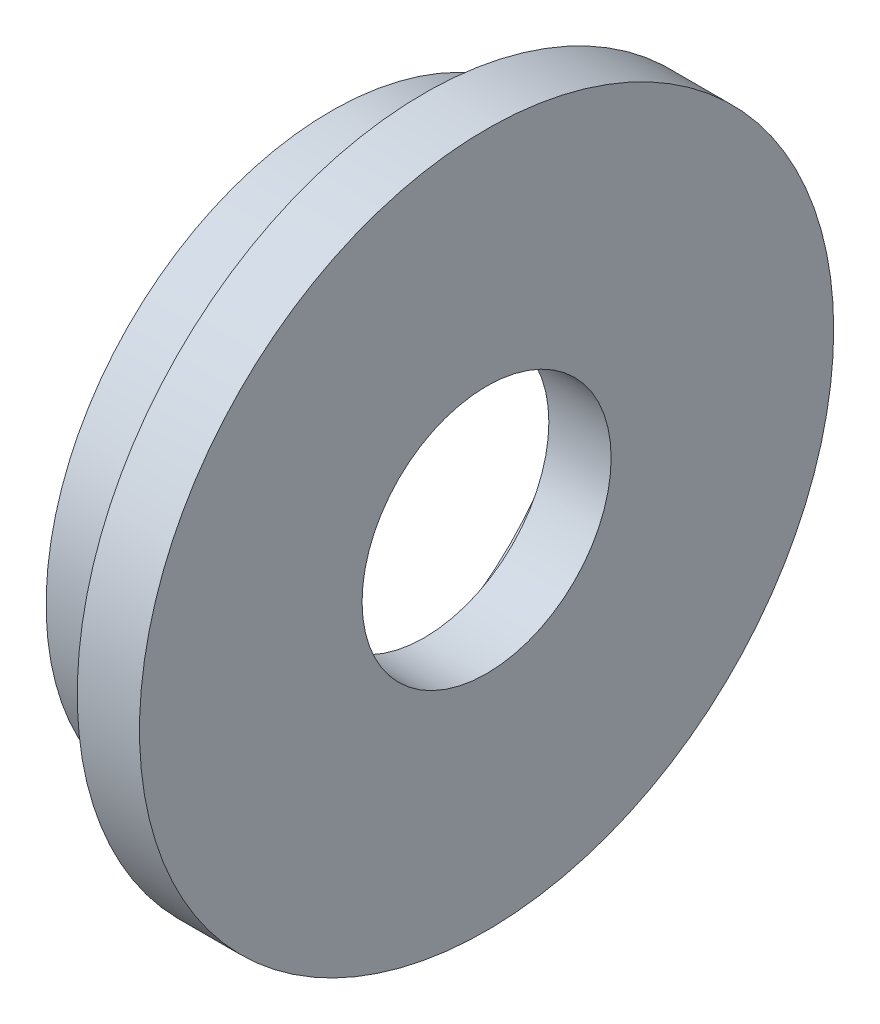
ISO-10303-21;
HEADER;
FILE_DESCRIPTION(('STEP AP214'),'2;1');
FILE_NAME('part.step','',(''),(''),'','','');
FILE_SCHEMA(('AUTOMOTIVE_DESIGN { 1 0 10303 214 1 1 1 1 }'));
ENDSEC;
DATA;
#1=APPLICATION_CONTEXT('core data for automotive mechanical design processes');
#2=APPLICATION_PROTOCOL_DEFINITION('international standard','automotive_design',2000,#1);
#3=PRODUCT_CONTEXT('',#1,'mechanical');
#4=PRODUCT('Part','Part','',(#3));
#5=PRODUCT_RELATED_PRODUCT_CATEGORY('part','',(#4));
#6=PRODUCT_DEFINITION_FORMATION('','',#4);
#7=PRODUCT_DEFINITION_CONTEXT('part definition',#1,'design');
#8=PRODUCT_DEFINITION('design','',#6,#7);
#9=PRODUCT_DEFINITION_SHAPE('','',#8);
#10=(LENGTH_UNIT() NAMED_UNIT(*) SI_UNIT(.MILLI.,.METRE.));
#11=(NAMED_UNIT(*) PLANE_ANGLE_UNIT() SI_UNIT($,.RADIAN.));
#12=(NAMED_UNIT(*) SI_UNIT($,.STERADIAN.) SOLID_ANGLE_UNIT());
#13=UNCERTAINTY_MEASURE_WITH_UNIT(LENGTH_MEASURE(1.E-05),#10,'distance_accuracy_value','');
#14=(GEOMETRIC_REPRESENTATION_CONTEXT(3) GLOBAL_UNCERTAINTY_ASSIGNED_CONTEXT((#13)) GLOBAL_UNIT_ASSIGNED_CONTEXT((#10,
#11,#12)) REPRESENTATION_CONTEXT('',''));
#15=CARTESIAN_POINT('',(0.,0.,0.));
#16=DIRECTION('',(0.,0.,1.));
#17=DIRECTION('',(1.,0.,0.));
#18=AXIS2_PLACEMENT_3D('',#15,#16,#17);
#19=CARTESIAN_POINT('',(3.,-192.5,34.));
#20=DIRECTION('',(-1.,0.,0.));
#21=DIRECTION('',(0.,1.,0.));
#22=AXIS2_PLACEMENT_3D('',#19,#20,#21);
#23=PLANE('',#22);
#24=CARTESIAN_POINT('',(3.,-192.5,34.));
#25=DIRECTION('',(1.,0.,0.));
#26=DIRECTION('',(0.,0.,-1.));
#27=AXIS2_PLACEMENT_3D('',#24,#25,#26);
#28=CIRCLE('',#27,4.);
#29=CARTESIAN_POINT('',(3.,-192.5,30.));
#30=VERTEX_POINT('',#29);
#31=EDGE_CURVE('E23',#30,#30,#28,.T.);
#32=ORIENTED_EDGE('',*,*,#31,.T.);
#33=EDGE_LOOP('',(#32));
#34=FACE_BOUND('',#33,.T.);
#35=CARTESIAN_POINT('',(3.,-192.5,34.));
#36=DIRECTION('',(1.,0.,0.));
#37=DIRECTION('',(0.,0.,-1.));
#38=AXIS2_PLACEMENT_3D('',#35,#36,#37);
#39=CIRCLE('',#38,8.15);
#40=CARTESIAN_POINT('',(3.,-192.5,25.85));
#41=VERTEX_POINT('',#40);
#42=EDGE_CURVE('E37',#41,#41,#39,.T.);
#43=ORIENTED_EDGE('',*,*,#42,.F.);
#44=EDGE_LOOP('',(#43));
#45=FACE_BOUND('',#44,.T.);
#46=ADVANCED_FACE('F14',(#34,#45),#23,.T.);
#47=CARTESIAN_POINT('',(3.,-192.5,34.));
#48=DIRECTION('',(1.,0.,0.));
#49=DIRECTION('',(0.,0.,1.));
#50=AXIS2_PLACEMENT_3D('',#47,#48,#49);
#51=CYLINDRICAL_SURFACE('',#50,11.15);
#52=CARTESIAN_POINT('',(3.,-192.5,34.));
#53=DIRECTION('',(1.,0.,0.));
#54=DIRECTION('',(0.,0.,-1.));
#55=AXIS2_PLACEMENT_3D('',#52,#53,#54);
#56=CIRCLE('',#55,11.15);
#57=CARTESIAN_POINT('',(3.,-192.5,22.85));
#58=VERTEX_POINT('',#57);
#59=EDGE_CURVE('E33',#58,#58,#56,.T.);
#60=ORIENTED_EDGE('',*,*,#59,.T.);
#61=EDGE_LOOP('',(#60));
#62=FACE_BOUND('',#61,.T.);
#63=CARTESIAN_POINT('',(5.,-192.5,34.));
#64=DIRECTION('',(1.,0.,0.));
#65=DIRECTION('',(0.,0.,-1.));
#66=AXIS2_PLACEMENT_3D('',#63,#64,#65);
#67=CIRCLE('',#66,11.15);
#68=CARTESIAN_POINT('',(5.,-192.5,22.85));
#69=VERTEX_POINT('',#68);
#70=EDGE_CURVE('E41',#69,#69,#67,.T.);
#71=ORIENTED_EDGE('',*,*,#70,.F.);
#72=EDGE_LOOP('',(#71));
#73=FACE_BOUND('',#72,.T.);
#74=ADVANCED_FACE('F16',(#62,#73),#51,.T.);
#75=CARTESIAN_POINT('',(3.,-192.5,34.));
#76=DIRECTION('',(1.,0.,0.));
#77=DIRECTION('',(0.,0.,1.));
#78=AXIS2_PLACEMENT_3D('',#75,#76,#77);
#79=CYLINDRICAL_SURFACE('',#78,4.);
#80=ORIENTED_EDGE('',*,*,#31,.F.);
#81=EDGE_LOOP('',(#80));
#82=FACE_BOUND('',#81,.T.);
#83=CARTESIAN_POINT('',(5.,-192.5,34.));
#84=DIRECTION('',(1.,0.,0.));
#85=DIRECTION('',(0.,0.,-1.));
#86=AXIS2_PLACEMENT_3D('',#83,#84,#85);
#87=CIRCLE('',#86,4.);
#88=CARTESIAN_POINT('',(5.,-192.5,30.));
#89=VERTEX_POINT('',#88);
#90=EDGE_CURVE('E18',#89,#89,#87,.T.);
#91=ORIENTED_EDGE('',*,*,#90,.T.);
#92=EDGE_LOOP('',(#91));
#93=FACE_BOUND('',#92,.T.);
#94=ADVANCED_FACE('F76',(#82,#93),#79,.F.);
#95=CARTESIAN_POINT('',(3.,-192.5,34.));
#96=DIRECTION('',(1.,0.,0.));
#97=DIRECTION('',(0.,0.,-1.));
#98=AXIS2_PLACEMENT_3D('',#95,#96,#97);
#99=CIRCLE('',#98,9.15);
#100=CARTESIAN_POINT('',(3.,-192.5,24.85));
#101=VERTEX_POINT('',#100);
#102=EDGE_CURVE('E9',#101,#101,#99,.T.);
#103=ORIENTED_EDGE('',*,*,#102,.T.);
#104=EDGE_LOOP('',(#103));
#105=FACE_BOUND('',#104,.T.);
#106=ORIENTED_EDGE('',*,*,#59,.F.);
#107=EDGE_LOOP('',(#106));
#108=FACE_BOUND('',#107,.T.);
#109=ADVANCED_FACE('F71',(#105,#108),#23,.T.);
#110=CARTESIAN_POINT('',(5.,-192.5,34.));
#111=DIRECTION('',(-1.,0.,0.));
#112=DIRECTION('',(0.,1.,0.));
#113=AXIS2_PLACEMENT_3D('',#110,#111,#112);
#114=PLANE('',#113);
#115=ORIENTED_EDGE('',*,*,#70,.T.);
#116=EDGE_LOOP('',(#115));
#117=FACE_BOUND('',#116,.T.);
#118=ORIENTED_EDGE('',*,*,#90,.F.);
#119=EDGE_LOOP('',(#118));
#120=FACE_BOUND('',#119,.T.);
#121=ADVANCED_FACE('F81',(#117,#120),#114,.F.);
#122=CARTESIAN_POINT('',(0.,-192.5,34.));
#123=DIRECTION('',(1.,0.,0.));
#124=DIRECTION('',(0.,0.,1.));
#125=AXIS2_PLACEMENT_3D('',#122,#123,#124);
#126=CYLINDRICAL_SURFACE('',#125,8.15);
#127=CARTESIAN_POINT('',(0.,-192.5,34.));
#128=DIRECTION('',(1.,0.,0.));
#129=DIRECTION('',(0.,0.,-1.));
#130=AXIS2_PLACEMENT_3D('',#127,#128,#129);
#131=CIRCLE('',#130,8.15);
#132=CARTESIAN_POINT('',(0.,-192.5,25.85));
#133=VERTEX_POINT('',#132);
#134=EDGE_CURVE('E52',#133,#133,#131,.T.);
#135=ORIENTED_EDGE('',*,*,#134,.F.);
#136=EDGE_LOOP('',(#135));
#137=FACE_BOUND('',#136,.T.);
#138=ORIENTED_EDGE('',*,*,#42,.T.);
#139=EDGE_LOOP('',(#138));
#140=FACE_BOUND('',#139,.T.);
#141=ADVANCED_FACE('F66',(#137,#140),#126,.F.);
#142=CARTESIAN_POINT('',(0.,-192.5,34.));
#143=DIRECTION('',(1.,0.,0.));
#144=DIRECTION('',(0.,0.,1.));
#145=AXIS2_PLACEMENT_3D('',#142,#143,#144);
#146=CYLINDRICAL_SURFACE('',#145,9.15);
#147=CARTESIAN_POINT('',(0.,-192.5,34.));
#148=DIRECTION('',(1.,0.,0.));
#149=DIRECTION('',(0.,0.,-1.));
#150=AXIS2_PLACEMENT_3D('',#147,#148,#149);
#151=CIRCLE('',#150,9.15);
#152=CARTESIAN_POINT('',(0.,-192.5,24.85));
#153=VERTEX_POINT('',#152);
#154=EDGE_CURVE('E44',#153,#153,#151,.T.);
#155=ORIENTED_EDGE('',*,*,#154,.T.);
#156=EDGE_LOOP('',(#155));
#157=FACE_BOUND('',#156,.T.);
#158=ORIENTED_EDGE('',*,*,#102,.F.);
#159=EDGE_LOOP('',(#158));
#160=FACE_BOUND('',#159,.T.);
#161=ADVANCED_FACE('F109',(#157,#160),#146,.T.);
#162=CARTESIAN_POINT('',(0.,-192.5,34.));
#163=DIRECTION('',(-1.,0.,0.));
#164=DIRECTION('',(0.,1.,0.));
#165=AXIS2_PLACEMENT_3D('',#162,#163,#164);
#166=PLANE('',#165);
#167=ORIENTED_EDGE('',*,*,#134,.T.);
#168=EDGE_LOOP('',(#167));
#169=FACE_BOUND('',#168,.T.);
#170=ORIENTED_EDGE('',*,*,#154,.F.);
#171=EDGE_LOOP('',(#170));
#172=FACE_BOUND('',#171,.T.);
#173=ADVANCED_FACE('F116',(#169,#172),#166,.T.);
#174=CLOSED_SHELL('',(#46,#74,#94,#109,#121,#141,#161,#173));
#175=MANIFOLD_SOLID_BREP('B1',#174);
#176=ADVANCED_BREP_SHAPE_REPRESENTATION('',(#18,#175),#14);
#177=SHAPE_DEFINITION_REPRESENTATION(#9,#176);
ENDSEC;
END-ISO-10303-21;
